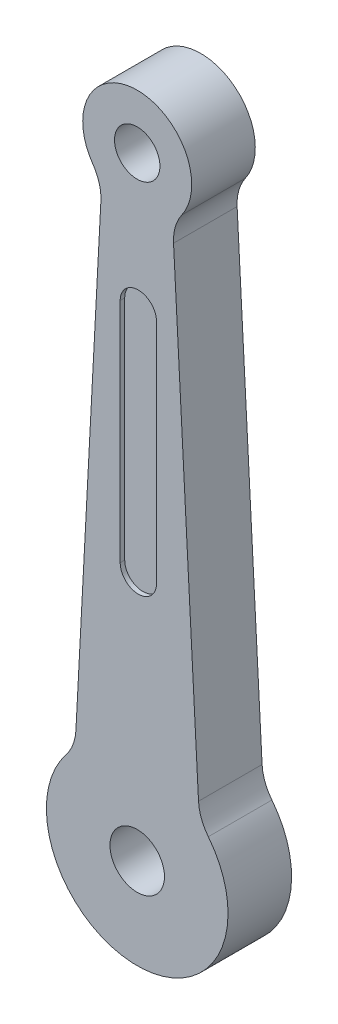
ISO-10303-21;
HEADER;
FILE_DESCRIPTION(('STEP AP214'),'2;1');
FILE_NAME('part.step','',(''),(''),'','','');
FILE_SCHEMA(('AUTOMOTIVE_DESIGN { 1 0 10303 214 1 1 1 1 }'));
ENDSEC;
DATA;
#1=APPLICATION_CONTEXT('core data for automotive mechanical design processes');
#2=APPLICATION_PROTOCOL_DEFINITION('international standard','automotive_design',2000,#1);
#3=PRODUCT_CONTEXT('',#1,'mechanical');
#4=PRODUCT('Part','Part','',(#3));
#5=PRODUCT_RELATED_PRODUCT_CATEGORY('part','',(#4));
#6=PRODUCT_DEFINITION_FORMATION('','',#4);
#7=PRODUCT_DEFINITION_CONTEXT('part definition',#1,'design');
#8=PRODUCT_DEFINITION('design','',#6,#7);
#9=PRODUCT_DEFINITION_SHAPE('','',#8);
#10=(LENGTH_UNIT() NAMED_UNIT(*) SI_UNIT(.MILLI.,.METRE.));
#11=(NAMED_UNIT(*) PLANE_ANGLE_UNIT() SI_UNIT($,.RADIAN.));
#12=(NAMED_UNIT(*) SI_UNIT($,.STERADIAN.) SOLID_ANGLE_UNIT());
#13=UNCERTAINTY_MEASURE_WITH_UNIT(LENGTH_MEASURE(1.E-05),#10,'distance_accuracy_value','');
#14=(GEOMETRIC_REPRESENTATION_CONTEXT(3) GLOBAL_UNCERTAINTY_ASSIGNED_CONTEXT((#13)) GLOBAL_UNIT_ASSIGNED_CONTEXT((#10,
#11,#12)) REPRESENTATION_CONTEXT('',''));
#15=CARTESIAN_POINT('',(0.,0.,0.));
#16=DIRECTION('',(0.,0.,1.));
#17=DIRECTION('',(1.,0.,0.));
#18=AXIS2_PLACEMENT_3D('',#15,#16,#17);
#19=CARTESIAN_POINT('',(-17.9859552555201,122.330926886847,-14.));
#20=DIRECTION('',(0.,0.,1.));
#21=DIRECTION('',(1.,0.,0.));
#22=AXIS2_PLACEMENT_3D('',#19,#20,#21);
#23=CYLINDRICAL_SURFACE('',#22,10.);
#24=CARTESIAN_POINT('',(-17.9859552555201,122.330926886847,0.));
#25=DIRECTION('',(0.,0.,-1.));
#26=DIRECTION('',(1.,0.,0.));
#27=AXIS2_PLACEMENT_3D('',#24,#25,#26);
#28=CIRCLE('',#27,10.);
#29=CARTESIAN_POINT('',(-9.81052104846552,128.089596483735,0.));
#30=VERTEX_POINT('',#29);
#31=CARTESIAN_POINT('',(-8.,121.801117831856,0.));
#32=VERTEX_POINT('',#31);
#33=EDGE_CURVE('E233',#30,#32,#28,.T.);
#34=ORIENTED_EDGE('',*,*,#33,.F.);
#35=DIRECTION('',(0.,0.,1.));
#36=VECTOR('',#35,1.);
#37=CARTESIAN_POINT('',(-9.81052104846552,128.089596483735,-14.));
#38=LINE('',#37,#36);
#39=CARTESIAN_POINT('',(-9.81052104846552,128.089596483735,-14.));
#40=VERTEX_POINT('',#39);
#41=EDGE_CURVE('E11',#40,#30,#38,.T.);
#42=ORIENTED_EDGE('',*,*,#41,.F.);
#43=CARTESIAN_POINT('',(-17.9859552555201,122.330926886847,-14.));
#44=DIRECTION('',(0.,0.,-1.));
#45=DIRECTION('',(1.,0.,0.));
#46=AXIS2_PLACEMENT_3D('',#43,#44,#45);
#47=CIRCLE('',#46,10.);
#48=CARTESIAN_POINT('',(-8.,121.801117831856,-14.));
#49=VERTEX_POINT('',#48);
#50=EDGE_CURVE('E257',#40,#49,#47,.T.);
#51=ORIENTED_EDGE('',*,*,#50,.T.);
#52=DIRECTION('',(0.,0.,1.));
#53=VECTOR('',#52,1.);
#54=CARTESIAN_POINT('',(-8.,121.801117831856,-14.));
#55=LINE('',#54,#53);
#56=EDGE_CURVE('E41',#49,#32,#55,.T.);
#57=ORIENTED_EDGE('',*,*,#56,.T.);
#58=EDGE_LOOP('',(#34,#42,#51,#57));
#59=FACE_BOUND('',#58,.T.);
#60=ADVANCED_FACE('F38',(#59),#23,.F.);
#61=CARTESIAN_POINT('',(0.,135.,-14.));
#62=DIRECTION('',(0.,0.,1.));
#63=DIRECTION('',(1.,0.,0.));
#64=AXIS2_PLACEMENT_3D('',#61,#62,#63);
#65=CYLINDRICAL_SURFACE('',#64,12.);
#66=CARTESIAN_POINT('',(0.,135.,0.));
#67=DIRECTION('',(0.,0.,1.));
#68=DIRECTION('',(1.,0.,0.));
#69=AXIS2_PLACEMENT_3D('',#66,#67,#68);
#70=CIRCLE('',#69,12.);
#71=CARTESIAN_POINT('',(9.81052104846553,128.089596483735,0.));
#72=VERTEX_POINT('',#71);
#73=EDGE_CURVE('E254',#72,#30,#70,.T.);
#74=ORIENTED_EDGE('',*,*,#73,.F.);
#75=DIRECTION('',(0.,0.,1.));
#76=VECTOR('',#75,1.);
#77=CARTESIAN_POINT('',(9.81052104846553,128.089596483735,-14.));
#78=LINE('',#77,#76);
#79=CARTESIAN_POINT('',(9.81052104846553,128.089596483735,-14.));
#80=VERTEX_POINT('',#79);
#81=EDGE_CURVE('E46',#80,#72,#78,.T.);
#82=ORIENTED_EDGE('',*,*,#81,.F.);
#83=CARTESIAN_POINT('',(0.,135.,-14.));
#84=DIRECTION('',(0.,0.,1.));
#85=DIRECTION('',(1.,0.,0.));
#86=AXIS2_PLACEMENT_3D('',#83,#84,#85);
#87=CIRCLE('',#86,12.);
#88=EDGE_CURVE('E278',#80,#40,#87,.T.);
#89=ORIENTED_EDGE('',*,*,#88,.T.);
#90=ORIENTED_EDGE('',*,*,#41,.T.);
#91=EDGE_LOOP('',(#74,#82,#89,#90));
#92=FACE_BOUND('',#91,.T.);
#93=ADVANCED_FACE('F303',(#92),#65,.T.);
#94=CARTESIAN_POINT('',(17.9859552555201,122.330926886847,-14.));
#95=DIRECTION('',(0.,0.,1.));
#96=DIRECTION('',(1.,0.,0.));
#97=AXIS2_PLACEMENT_3D('',#94,#95,#96);
#98=CYLINDRICAL_SURFACE('',#97,10.);
#99=CARTESIAN_POINT('',(17.9859552555201,122.330926886847,0.));
#100=DIRECTION('',(0.,0.,-1.));
#101=DIRECTION('',(-1.,0.,0.));
#102=AXIS2_PLACEMENT_3D('',#99,#100,#101);
#103=CIRCLE('',#102,10.);
#104=CARTESIAN_POINT('',(8.,121.801117831856,0.));
#105=VERTEX_POINT('',#104);
#106=EDGE_CURVE('E251',#105,#72,#103,.T.);
#107=ORIENTED_EDGE('',*,*,#106,.F.);
#108=DIRECTION('',(0.,0.,1.));
#109=VECTOR('',#108,1.);
#110=CARTESIAN_POINT('',(8.,121.801117831856,-14.));
#111=LINE('',#110,#109);
#112=CARTESIAN_POINT('',(8.,121.801117831856,-14.));
#113=VERTEX_POINT('',#112);
#114=EDGE_CURVE('E282',#113,#105,#111,.T.);
#115=ORIENTED_EDGE('',*,*,#114,.F.);
#116=CARTESIAN_POINT('',(17.9859552555201,122.330926886847,-14.));
#117=DIRECTION('',(0.,0.,-1.));
#118=DIRECTION('',(-1.,0.,0.));
#119=AXIS2_PLACEMENT_3D('',#116,#117,#118);
#120=CIRCLE('',#119,10.);
#121=EDGE_CURVE('E275',#113,#80,#120,.T.);
#122=ORIENTED_EDGE('',*,*,#121,.T.);
#123=ORIENTED_EDGE('',*,*,#81,.T.);
#124=EDGE_LOOP('',(#107,#115,#122,#123));
#125=FACE_BOUND('',#124,.T.);
#126=ADVANCED_FACE('F323',(#125),#98,.F.);
#127=CARTESIAN_POINT('',(8.,121.801117831856,-14.));
#128=DIRECTION('',(0.998595525552012,0.0529809054990608,0.));
#129=DIRECTION('',(-0.0529809054990608,0.998595525552012,0.));
#130=AXIS2_PLACEMENT_3D('',#127,#128,#129);
#131=PLANE('',#130);
#132=DIRECTION('',(-0.0529809054990608,0.998595525552012,0.));
#133=VECTOR('',#132,1.);
#134=CARTESIAN_POINT('',(8.,121.801117831856,0.));
#135=LINE('',#134,#133);
#136=CARTESIAN_POINT('',(13.5,18.1359324447652,0.));
#137=VERTEX_POINT('',#136);
#138=EDGE_CURVE('E248',#137,#105,#135,.T.);
#139=ORIENTED_EDGE('',*,*,#138,.F.);
#140=DIRECTION('',(0.,0.,1.));
#141=VECTOR('',#140,1.);
#142=CARTESIAN_POINT('',(13.5,18.1359324447652,-14.));
#143=LINE('',#142,#141);
#144=CARTESIAN_POINT('',(13.5,18.1359324447652,-14.));
#145=VERTEX_POINT('',#144);
#146=EDGE_CURVE('E284',#145,#137,#143,.T.);
#147=ORIENTED_EDGE('',*,*,#146,.F.);
#148=DIRECTION('',(-0.0529809054990608,0.998595525552012,0.));
#149=VECTOR('',#148,1.);
#150=CARTESIAN_POINT('',(8.,121.801117831856,-14.));
#151=LINE('',#150,#149);
#152=EDGE_CURVE('E272',#145,#113,#151,.T.);
#153=ORIENTED_EDGE('',*,*,#152,.T.);
#154=ORIENTED_EDGE('',*,*,#114,.T.);
#155=EDGE_LOOP('',(#139,#147,#153,#154));
#156=FACE_BOUND('',#155,.T.);
#157=ADVANCED_FACE('F321',(#156),#131,.T.);
#158=CARTESIAN_POINT('',(23.4859552555201,18.6657414997558,-14.));
#159=DIRECTION('',(0.,0.,1.));
#160=DIRECTION('',(1.,0.,0.));
#161=AXIS2_PLACEMENT_3D('',#158,#159,#160);
#162=CYLINDRICAL_SURFACE('',#161,10.);
#163=CARTESIAN_POINT('',(23.4859552555201,18.6657414997558,0.));
#164=DIRECTION('',(0.,0.,-1.));
#165=DIRECTION('',(-1.,0.,0.));
#166=AXIS2_PLACEMENT_3D('',#163,#164,#165);
#167=CIRCLE('',#166,10.);
#168=CARTESIAN_POINT('',(15.6573035036801,12.4438276665039,0.));
#169=VERTEX_POINT('',#168);
#170=EDGE_CURVE('E245',#169,#137,#167,.T.);
#171=ORIENTED_EDGE('',*,*,#170,.F.);
#172=DIRECTION('',(0.,0.,1.));
#173=VECTOR('',#172,1.);
#174=CARTESIAN_POINT('',(15.6573035036801,12.4438276665039,-14.));
#175=LINE('',#174,#173);
#176=CARTESIAN_POINT('',(15.6573035036801,12.4438276665039,-14.));
#177=VERTEX_POINT('',#176);
#178=EDGE_CURVE('E286',#177,#169,#175,.T.);
#179=ORIENTED_EDGE('',*,*,#178,.F.);
#180=CARTESIAN_POINT('',(23.4859552555201,18.6657414997558,-14.));
#181=DIRECTION('',(0.,0.,-1.));
#182=DIRECTION('',(-1.,0.,0.));
#183=AXIS2_PLACEMENT_3D('',#180,#181,#182);
#184=CIRCLE('',#183,10.);
#185=EDGE_CURVE('E269',#177,#145,#184,.T.);
#186=ORIENTED_EDGE('',*,*,#185,.T.);
#187=ORIENTED_EDGE('',*,*,#146,.T.);
#188=EDGE_LOOP('',(#171,#179,#186,#187));
#189=FACE_BOUND('',#188,.T.);
#190=ADVANCED_FACE('F317',(#189),#162,.F.);
#191=CARTESIAN_POINT('',(0.,0.,-14.));
#192=DIRECTION('',(0.,0.,1.));
#193=DIRECTION('',(1.,0.,0.));
#194=AXIS2_PLACEMENT_3D('',#191,#192,#193);
#195=CYLINDRICAL_SURFACE('',#194,20.);
#196=CARTESIAN_POINT('',(0.,0.,0.));
#197=DIRECTION('',(0.,0.,1.));
#198=DIRECTION('',(1.,0.,0.));
#199=AXIS2_PLACEMENT_3D('',#196,#197,#198);
#200=CIRCLE('',#199,20.);
#201=CARTESIAN_POINT('',(-15.6573035036801,12.4438276665039,0.));
#202=VERTEX_POINT('',#201);
#203=EDGE_CURVE('E242',#202,#169,#200,.T.);
#204=ORIENTED_EDGE('',*,*,#203,.F.);
#205=DIRECTION('',(0.,0.,1.));
#206=VECTOR('',#205,1.);
#207=CARTESIAN_POINT('',(-15.6573035036801,12.4438276665039,-14.));
#208=LINE('',#207,#206);
#209=CARTESIAN_POINT('',(-15.6573035036801,12.4438276665039,-14.));
#210=VERTEX_POINT('',#209);
#211=EDGE_CURVE('E288',#210,#202,#208,.T.);
#212=ORIENTED_EDGE('',*,*,#211,.F.);
#213=CARTESIAN_POINT('',(0.,0.,-14.));
#214=DIRECTION('',(0.,0.,1.));
#215=DIRECTION('',(1.,0.,0.));
#216=AXIS2_PLACEMENT_3D('',#213,#214,#215);
#217=CIRCLE('',#216,20.);
#218=EDGE_CURVE('E266',#210,#177,#217,.T.);
#219=ORIENTED_EDGE('',*,*,#218,.T.);
#220=ORIENTED_EDGE('',*,*,#178,.T.);
#221=EDGE_LOOP('',(#204,#212,#219,#220));
#222=FACE_BOUND('',#221,.T.);
#223=ADVANCED_FACE('F315',(#222),#195,.T.);
#224=CARTESIAN_POINT('',(-23.4859552555201,18.6657414997558,-14.));
#225=DIRECTION('',(0.,0.,1.));
#226=DIRECTION('',(1.,0.,0.));
#227=AXIS2_PLACEMENT_3D('',#224,#225,#226);
#228=CYLINDRICAL_SURFACE('',#227,10.);
#229=CARTESIAN_POINT('',(-23.4859552555201,18.6657414997558,0.));
#230=DIRECTION('',(0.,0.,-1.));
#231=DIRECTION('',(1.,0.,0.));
#232=AXIS2_PLACEMENT_3D('',#229,#230,#231);
#233=CIRCLE('',#232,10.);
#234=CARTESIAN_POINT('',(-13.5,18.1359324447652,0.));
#235=VERTEX_POINT('',#234);
#236=EDGE_CURVE('E239',#235,#202,#233,.T.);
#237=ORIENTED_EDGE('',*,*,#236,.F.);
#238=DIRECTION('',(0.,0.,1.));
#239=VECTOR('',#238,1.);
#240=CARTESIAN_POINT('',(-13.5,18.1359324447652,-14.));
#241=LINE('',#240,#239);
#242=CARTESIAN_POINT('',(-13.5,18.1359324447652,-14.));
#243=VERTEX_POINT('',#242);
#244=EDGE_CURVE('E289',#243,#235,#241,.T.);
#245=ORIENTED_EDGE('',*,*,#244,.F.);
#246=CARTESIAN_POINT('',(-23.4859552555201,18.6657414997558,-14.));
#247=DIRECTION('',(0.,0.,-1.));
#248=DIRECTION('',(1.,0.,0.));
#249=AXIS2_PLACEMENT_3D('',#246,#247,#248);
#250=CIRCLE('',#249,10.);
#251=EDGE_CURVE('E263',#243,#210,#250,.T.);
#252=ORIENTED_EDGE('',*,*,#251,.T.);
#253=ORIENTED_EDGE('',*,*,#211,.T.);
#254=EDGE_LOOP('',(#237,#245,#252,#253));
#255=FACE_BOUND('',#254,.T.);
#256=ADVANCED_FACE('F311',(#255),#228,.F.);
#257=CARTESIAN_POINT('',(-8.,121.801117831856,-14.));
#258=DIRECTION('',(-0.998595525552012,0.0529809054990608,0.));
#259=DIRECTION('',(-0.0529809054990608,-0.998595525552012,0.));
#260=AXIS2_PLACEMENT_3D('',#257,#258,#259);
#261=PLANE('',#260);
#262=DIRECTION('',(-0.0529809054990608,-0.998595525552012,0.));
#263=VECTOR('',#262,1.);
#264=CARTESIAN_POINT('',(-8.,121.801117831856,0.));
#265=LINE('',#264,#263);
#266=EDGE_CURVE('E236',#32,#235,#265,.T.);
#267=ORIENTED_EDGE('',*,*,#266,.F.);
#268=ORIENTED_EDGE('',*,*,#56,.F.);
#269=DIRECTION('',(-0.0529809054990608,-0.998595525552012,0.));
#270=VECTOR('',#269,1.);
#271=CARTESIAN_POINT('',(-8.,121.801117831856,-14.));
#272=LINE('',#271,#270);
#273=EDGE_CURVE('E260',#49,#243,#272,.T.);
#274=ORIENTED_EDGE('',*,*,#273,.T.);
#275=ORIENTED_EDGE('',*,*,#244,.T.);
#276=EDGE_LOOP('',(#267,#268,#274,#275));
#277=FACE_BOUND('',#276,.T.);
#278=ADVANCED_FACE('F297',(#277),#261,.T.);
#279=CARTESIAN_POINT('',(-17.9859552555201,122.330926886847,-14.));
#280=DIRECTION('',(0.,0.,1.));
#281=DIRECTION('',(1.,0.,0.));
#282=AXIS2_PLACEMENT_3D('',#279,#280,#281);
#283=PLANE('',#282);
#284=DIRECTION('',(0.,-1.,0.));
#285=VECTOR('',#284,1.);
#286=CARTESIAN_POINT('',(4.24807271995307,105.,-14.));
#287=LINE('',#286,#285);
#288=CARTESIAN_POINT('',(4.24807271995307,105.,-14.));
#289=VERTEX_POINT('',#288);
#290=CARTESIAN_POINT('',(4.24807271995308,55.,-14.));
#291=VERTEX_POINT('',#290);
#292=EDGE_CURVE('E166',#289,#291,#287,.T.);
#293=ORIENTED_EDGE('',*,*,#292,.F.);
#294=CARTESIAN_POINT('',(0.248072719953071,105.,-14.));
#295=DIRECTION('',(0.,0.,-1.));
#296=DIRECTION('',(-1.,0.,0.));
#297=AXIS2_PLACEMENT_3D('',#294,#295,#296);
#298=CIRCLE('',#297,4.);
#299=CARTESIAN_POINT('',(-3.75192728004693,105.,-14.));
#300=VERTEX_POINT('',#299);
#301=EDGE_CURVE('E54',#300,#289,#298,.T.);
#302=ORIENTED_EDGE('',*,*,#301,.F.);
#303=DIRECTION('',(0.,1.,0.));
#304=VECTOR('',#303,1.);
#305=CARTESIAN_POINT('',(-3.75192728004692,55.,-14.));
#306=LINE('',#305,#304);
#307=CARTESIAN_POINT('',(-3.75192728004692,55.,-14.));
#308=VERTEX_POINT('',#307);
#309=EDGE_CURVE('E173',#308,#300,#306,.T.);
#310=ORIENTED_EDGE('',*,*,#309,.F.);
#311=CARTESIAN_POINT('',(0.248072719953078,55.,-14.));
#312=DIRECTION('',(0.,0.,-1.));
#313=DIRECTION('',(-1.,0.,0.));
#314=AXIS2_PLACEMENT_3D('',#311,#312,#313);
#315=CIRCLE('',#314,4.);
#316=EDGE_CURVE('E155',#291,#308,#315,.T.);
#317=ORIENTED_EDGE('',*,*,#316,.F.);
#318=EDGE_LOOP('',(#293,#302,#310,#317));
#319=FACE_BOUND('',#318,.T.);
#320=CARTESIAN_POINT('',(0.,135.,-14.));
#321=DIRECTION('',(0.,0.,1.));
#322=DIRECTION('',(1.,0.,0.));
#323=AXIS2_PLACEMENT_3D('',#320,#321,#322);
#324=CIRCLE('',#323,5.00000000000001);
#325=CARTESIAN_POINT('',(5.00000000000001,135.,-14.));
#326=VERTEX_POINT('',#325);
#327=EDGE_CURVE('E224',#326,#326,#324,.T.);
#328=ORIENTED_EDGE('',*,*,#327,.T.);
#329=EDGE_LOOP('',(#328));
#330=FACE_BOUND('',#329,.T.);
#331=CARTESIAN_POINT('',(0.,0.,-14.));
#332=DIRECTION('',(0.,0.,1.));
#333=DIRECTION('',(1.,0.,0.));
#334=AXIS2_PLACEMENT_3D('',#331,#332,#333);
#335=CIRCLE('',#334,6.);
#336=CARTESIAN_POINT('',(6.,0.,-14.));
#337=VERTEX_POINT('',#336);
#338=EDGE_CURVE('E230',#337,#337,#335,.T.);
#339=ORIENTED_EDGE('',*,*,#338,.T.);
#340=EDGE_LOOP('',(#339));
#341=FACE_BOUND('',#340,.T.);
#342=ORIENTED_EDGE('',*,*,#50,.F.);
#343=ORIENTED_EDGE('',*,*,#88,.F.);
#344=ORIENTED_EDGE('',*,*,#121,.F.);
#345=ORIENTED_EDGE('',*,*,#152,.F.);
#346=ORIENTED_EDGE('',*,*,#185,.F.);
#347=ORIENTED_EDGE('',*,*,#218,.F.);
#348=ORIENTED_EDGE('',*,*,#251,.F.);
#349=ORIENTED_EDGE('',*,*,#273,.F.);
#350=EDGE_LOOP('',(#342,#343,#344,#345,#346,#347,#348,#349));
#351=FACE_BOUND('',#350,.T.);
#352=ADVANCED_FACE('F170',(#319,#330,#341,#351),#283,.F.);
#353=CARTESIAN_POINT('',(-17.9859552555201,122.330926886847,0.));
#354=DIRECTION('',(0.,0.,1.));
#355=DIRECTION('',(1.,0.,0.));
#356=AXIS2_PLACEMENT_3D('',#353,#354,#355);
#357=PLANE('',#356);
#358=CARTESIAN_POINT('',(0.248072719953071,105.,0.));
#359=DIRECTION('',(0.,0.,1.));
#360=DIRECTION('',(1.,0.,0.));
#361=AXIS2_PLACEMENT_3D('',#358,#359,#360);
#362=CIRCLE('',#361,4.);
#363=CARTESIAN_POINT('',(4.24807271995307,105.,0.));
#364=VERTEX_POINT('',#363);
#365=CARTESIAN_POINT('',(-3.75192728004693,105.,0.));
#366=VERTEX_POINT('',#365);
#367=EDGE_CURVE('E62',#364,#366,#362,.T.);
#368=ORIENTED_EDGE('',*,*,#367,.F.);
#369=DIRECTION('',(0.,1.,0.));
#370=VECTOR('',#369,1.);
#371=CARTESIAN_POINT('',(4.24807271995307,105.,0.));
#372=LINE('',#371,#370);
#373=CARTESIAN_POINT('',(4.24807271995308,55.,0.));
#374=VERTEX_POINT('',#373);
#375=EDGE_CURVE('E198',#374,#364,#372,.T.);
#376=ORIENTED_EDGE('',*,*,#375,.F.);
#377=CARTESIAN_POINT('',(0.248072719953078,55.,0.));
#378=DIRECTION('',(0.,0.,1.));
#379=DIRECTION('',(1.,0.,0.));
#380=AXIS2_PLACEMENT_3D('',#377,#378,#379);
#381=CIRCLE('',#380,4.);
#382=CARTESIAN_POINT('',(-3.75192728004692,55.,0.));
#383=VERTEX_POINT('',#382);
#384=EDGE_CURVE('E195',#383,#374,#381,.T.);
#385=ORIENTED_EDGE('',*,*,#384,.F.);
#386=DIRECTION('',(0.,-1.,0.));
#387=VECTOR('',#386,1.);
#388=CARTESIAN_POINT('',(-3.75192728004693,105.,0.));
#389=LINE('',#388,#387);
#390=EDGE_CURVE('E192',#366,#383,#389,.T.);
#391=ORIENTED_EDGE('',*,*,#390,.F.);
#392=EDGE_LOOP('',(#368,#376,#385,#391));
#393=FACE_BOUND('',#392,.T.);
#394=CARTESIAN_POINT('',(0.,135.,0.));
#395=DIRECTION('',(0.,0.,1.));
#396=DIRECTION('',(1.,0.,0.));
#397=AXIS2_PLACEMENT_3D('',#394,#395,#396);
#398=CIRCLE('',#397,5.00000000000001);
#399=CARTESIAN_POINT('',(5.00000000000001,135.,0.));
#400=VERTEX_POINT('',#399);
#401=EDGE_CURVE('E216',#400,#400,#398,.T.);
#402=ORIENTED_EDGE('',*,*,#401,.F.);
#403=EDGE_LOOP('',(#402));
#404=FACE_BOUND('',#403,.T.);
#405=CARTESIAN_POINT('',(0.,0.,0.));
#406=DIRECTION('',(0.,0.,1.));
#407=DIRECTION('',(1.,0.,0.));
#408=AXIS2_PLACEMENT_3D('',#405,#406,#407);
#409=CIRCLE('',#408,6.);
#410=CARTESIAN_POINT('',(6.,0.,0.));
#411=VERTEX_POINT('',#410);
#412=EDGE_CURVE('E227',#411,#411,#409,.T.);
#413=ORIENTED_EDGE('',*,*,#412,.F.);
#414=EDGE_LOOP('',(#413));
#415=FACE_BOUND('',#414,.T.);
#416=ORIENTED_EDGE('',*,*,#33,.T.);
#417=ORIENTED_EDGE('',*,*,#266,.T.);
#418=ORIENTED_EDGE('',*,*,#236,.T.);
#419=ORIENTED_EDGE('',*,*,#203,.T.);
#420=ORIENTED_EDGE('',*,*,#170,.T.);
#421=ORIENTED_EDGE('',*,*,#138,.T.);
#422=ORIENTED_EDGE('',*,*,#106,.T.);
#423=ORIENTED_EDGE('',*,*,#73,.T.);
#424=EDGE_LOOP('',(#416,#417,#418,#419,#420,#421,#422,#423));
#425=FACE_BOUND('',#424,.T.);
#426=ADVANCED_FACE('F299',(#393,#404,#415,#425),#357,.T.);
#427=CARTESIAN_POINT('',(0.,0.,-14.));
#428=DIRECTION('',(0.,0.,1.));
#429=DIRECTION('',(1.,0.,0.));
#430=AXIS2_PLACEMENT_3D('',#427,#428,#429);
#431=CYLINDRICAL_SURFACE('',#430,6.);
#432=ORIENTED_EDGE('',*,*,#338,.F.);
#433=EDGE_LOOP('',(#432));
#434=FACE_BOUND('',#433,.T.);
#435=ORIENTED_EDGE('',*,*,#412,.T.);
#436=EDGE_LOOP('',(#435));
#437=FACE_BOUND('',#436,.T.);
#438=ADVANCED_FACE('F387',(#434,#437),#431,.F.);
#439=CARTESIAN_POINT('',(0.,135.,-14.));
#440=DIRECTION('',(0.,0.,1.));
#441=DIRECTION('',(1.,0.,0.));
#442=AXIS2_PLACEMENT_3D('',#439,#440,#441);
#443=CYLINDRICAL_SURFACE('',#442,5.00000000000001);
#444=ORIENTED_EDGE('',*,*,#327,.F.);
#445=EDGE_LOOP('',(#444));
#446=FACE_BOUND('',#445,.T.);
#447=ORIENTED_EDGE('',*,*,#401,.T.);
#448=EDGE_LOOP('',(#447));
#449=FACE_BOUND('',#448,.T.);
#450=ADVANCED_FACE('F392',(#446,#449),#443,.F.);
#451=CARTESIAN_POINT('',(0.248072719953071,105.,-1.));
#452=DIRECTION('',(0.,0.,1.));
#453=DIRECTION('',(1.,0.,0.));
#454=AXIS2_PLACEMENT_3D('',#451,#452,#453);
#455=CYLINDRICAL_SURFACE('',#454,4.);
#456=ORIENTED_EDGE('',*,*,#367,.T.);
#457=DIRECTION('',(0.,0.,1.));
#458=VECTOR('',#457,1.);
#459=CARTESIAN_POINT('',(-3.75192728004693,105.,-1.));
#460=LINE('',#459,#458);
#461=CARTESIAN_POINT('',(-3.75192728004693,105.,-1.));
#462=VERTEX_POINT('',#461);
#463=EDGE_CURVE('E213',#462,#366,#460,.T.);
#464=ORIENTED_EDGE('',*,*,#463,.F.);
#465=CARTESIAN_POINT('',(0.248072719953071,105.,-1.));
#466=DIRECTION('',(0.,0.,1.));
#467=DIRECTION('',(1.,0.,0.));
#468=AXIS2_PLACEMENT_3D('',#465,#466,#467);
#469=CIRCLE('',#468,4.);
#470=CARTESIAN_POINT('',(4.24807271995307,105.,-1.));
#471=VERTEX_POINT('',#470);
#472=EDGE_CURVE('E201',#471,#462,#469,.T.);
#473=ORIENTED_EDGE('',*,*,#472,.F.);
#474=DIRECTION('',(0.,0.,1.));
#475=VECTOR('',#474,1.);
#476=CARTESIAN_POINT('',(4.24807271995307,105.,-1.));
#477=LINE('',#476,#475);
#478=EDGE_CURVE('E214',#471,#364,#477,.T.);
#479=ORIENTED_EDGE('',*,*,#478,.T.);
#480=EDGE_LOOP('',(#456,#464,#473,#479));
#481=FACE_BOUND('',#480,.T.);
#482=ADVANCED_FACE('F404',(#481),#455,.F.);
#483=CARTESIAN_POINT('',(4.24807271995307,105.,-1.));
#484=DIRECTION('',(1.,0.,0.));
#485=DIRECTION('',(0.,1.,0.));
#486=AXIS2_PLACEMENT_3D('',#483,#484,#485);
#487=PLANE('',#486);
#488=ORIENTED_EDGE('',*,*,#375,.T.);
#489=ORIENTED_EDGE('',*,*,#478,.F.);
#490=DIRECTION('',(0.,1.,0.));
#491=VECTOR('',#490,1.);
#492=CARTESIAN_POINT('',(4.24807271995307,105.,-1.));
#493=LINE('',#492,#491);
#494=CARTESIAN_POINT('',(4.24807271995308,55.,-1.));
#495=VERTEX_POINT('',#494);
#496=EDGE_CURVE('E210',#495,#471,#493,.T.);
#497=ORIENTED_EDGE('',*,*,#496,.F.);
#498=DIRECTION('',(0.,0.,1.));
#499=VECTOR('',#498,1.);
#500=CARTESIAN_POINT('',(4.24807271995308,55.,-1.));
#501=LINE('',#500,#499);
#502=EDGE_CURVE('E217',#495,#374,#501,.T.);
#503=ORIENTED_EDGE('',*,*,#502,.T.);
#504=EDGE_LOOP('',(#488,#489,#497,#503));
#505=FACE_BOUND('',#504,.T.);
#506=ADVANCED_FACE('F421',(#505),#487,.F.);
#507=CARTESIAN_POINT('',(0.248072719953078,55.,-1.));
#508=DIRECTION('',(0.,0.,1.));
#509=DIRECTION('',(1.,0.,0.));
#510=AXIS2_PLACEMENT_3D('',#507,#508,#509);
#511=CYLINDRICAL_SURFACE('',#510,4.);
#512=ORIENTED_EDGE('',*,*,#384,.T.);
#513=ORIENTED_EDGE('',*,*,#502,.F.);
#514=CARTESIAN_POINT('',(0.248072719953078,55.,-1.));
#515=DIRECTION('',(0.,0.,1.));
#516=DIRECTION('',(1.,0.,0.));
#517=AXIS2_PLACEMENT_3D('',#514,#515,#516);
#518=CIRCLE('',#517,4.);
#519=CARTESIAN_POINT('',(-3.75192728004692,55.,-1.));
#520=VERTEX_POINT('',#519);
#521=EDGE_CURVE('E207',#520,#495,#518,.T.);
#522=ORIENTED_EDGE('',*,*,#521,.F.);
#523=DIRECTION('',(0.,0.,1.));
#524=VECTOR('',#523,1.);
#525=CARTESIAN_POINT('',(-3.75192728004692,55.,-1.));
#526=LINE('',#525,#524);
#527=EDGE_CURVE('E219',#520,#383,#526,.T.);
#528=ORIENTED_EDGE('',*,*,#527,.T.);
#529=EDGE_LOOP('',(#512,#513,#522,#528));
#530=FACE_BOUND('',#529,.T.);
#531=ADVANCED_FACE('F430',(#530),#511,.F.);
#532=CARTESIAN_POINT('',(-3.75192728004693,105.,-1.));
#533=DIRECTION('',(-1.,0.,0.));
#534=DIRECTION('',(0.,-1.,0.));
#535=AXIS2_PLACEMENT_3D('',#532,#533,#534);
#536=PLANE('',#535);
#537=ORIENTED_EDGE('',*,*,#390,.T.);
#538=ORIENTED_EDGE('',*,*,#527,.F.);
#539=DIRECTION('',(0.,-1.,0.));
#540=VECTOR('',#539,1.);
#541=CARTESIAN_POINT('',(-3.75192728004693,105.,-1.));
#542=LINE('',#541,#540);
#543=EDGE_CURVE('E204',#462,#520,#542,.T.);
#544=ORIENTED_EDGE('',*,*,#543,.F.);
#545=ORIENTED_EDGE('',*,*,#463,.T.);
#546=EDGE_LOOP('',(#537,#538,#544,#545));
#547=FACE_BOUND('',#546,.T.);
#548=ADVANCED_FACE('F440',(#547),#536,.F.);
#549=CARTESIAN_POINT('',(0.248072719953071,105.,-1.));
#550=DIRECTION('',(0.,0.,1.));
#551=DIRECTION('',(1.,0.,0.));
#552=AXIS2_PLACEMENT_3D('',#549,#550,#551);
#553=PLANE('',#552);
#554=ORIENTED_EDGE('',*,*,#472,.T.);
#555=ORIENTED_EDGE('',*,*,#543,.T.);
#556=ORIENTED_EDGE('',*,*,#521,.T.);
#557=ORIENTED_EDGE('',*,*,#496,.T.);
#558=EDGE_LOOP('',(#554,#555,#556,#557));
#559=FACE_BOUND('',#558,.T.);
#560=ADVANCED_FACE('F450',(#559),#553,.T.);
#561=CARTESIAN_POINT('',(0.248072719953071,105.,-13.));
#562=DIRECTION('',(0.,0.,-1.));
#563=DIRECTION('',(-1.,0.,0.));
#564=AXIS2_PLACEMENT_3D('',#561,#562,#563);
#565=CYLINDRICAL_SURFACE('',#564,4.);
#566=ORIENTED_EDGE('',*,*,#301,.T.);
#567=DIRECTION('',(0.,0.,-1.));
#568=VECTOR('',#567,1.);
#569=CARTESIAN_POINT('',(4.24807271995307,105.,-13.));
#570=LINE('',#569,#568);
#571=CARTESIAN_POINT('',(4.24807271995307,105.,-13.));
#572=VERTEX_POINT('',#571);
#573=EDGE_CURVE('E163',#572,#289,#570,.T.);
#574=ORIENTED_EDGE('',*,*,#573,.F.);
#575=CARTESIAN_POINT('',(0.248072719953071,105.,-13.));
#576=DIRECTION('',(0.,0.,-1.));
#577=DIRECTION('',(-1.,0.,0.));
#578=AXIS2_PLACEMENT_3D('',#575,#576,#577);
#579=CIRCLE('',#578,4.);
#580=CARTESIAN_POINT('',(-3.75192728004693,105.,-13.));
#581=VERTEX_POINT('',#580);
#582=EDGE_CURVE('E175',#581,#572,#579,.T.);
#583=ORIENTED_EDGE('',*,*,#582,.F.);
#584=DIRECTION('',(0.,0.,-1.));
#585=VECTOR('',#584,1.);
#586=CARTESIAN_POINT('',(-3.75192728004693,105.,-13.));
#587=LINE('',#586,#585);
#588=EDGE_CURVE('E187',#581,#300,#587,.T.);
#589=ORIENTED_EDGE('',*,*,#588,.T.);
#590=EDGE_LOOP('',(#566,#574,#583,#589));
#591=FACE_BOUND('',#590,.T.);
#592=ADVANCED_FACE('F460',(#591),#565,.F.);
#593=CARTESIAN_POINT('',(-3.75192728004692,55.,-13.));
#594=DIRECTION('',(-1.,0.,0.));
#595=DIRECTION('',(0.,-1.,0.));
#596=AXIS2_PLACEMENT_3D('',#593,#594,#595);
#597=PLANE('',#596);
#598=ORIENTED_EDGE('',*,*,#309,.T.);
#599=ORIENTED_EDGE('',*,*,#588,.F.);
#600=DIRECTION('',(0.,1.,0.));
#601=VECTOR('',#600,1.);
#602=CARTESIAN_POINT('',(-3.75192728004692,55.,-13.));
#603=LINE('',#602,#601);
#604=CARTESIAN_POINT('',(-3.75192728004692,55.,-13.));
#605=VERTEX_POINT('',#604);
#606=EDGE_CURVE('E184',#605,#581,#603,.T.);
#607=ORIENTED_EDGE('',*,*,#606,.F.);
#608=DIRECTION('',(0.,0.,-1.));
#609=VECTOR('',#608,1.);
#610=CARTESIAN_POINT('',(-3.75192728004692,55.,-13.));
#611=LINE('',#610,#609);
#612=EDGE_CURVE('E162',#605,#308,#611,.T.);
#613=ORIENTED_EDGE('',*,*,#612,.T.);
#614=EDGE_LOOP('',(#598,#599,#607,#613));
#615=FACE_BOUND('',#614,.T.);
#616=ADVANCED_FACE('F476',(#615),#597,.F.);
#617=CARTESIAN_POINT('',(0.248072719953078,55.,-13.));
#618=DIRECTION('',(0.,0.,-1.));
#619=DIRECTION('',(-1.,0.,0.));
#620=AXIS2_PLACEMENT_3D('',#617,#618,#619);
#621=CYLINDRICAL_SURFACE('',#620,4.);
#622=ORIENTED_EDGE('',*,*,#316,.T.);
#623=ORIENTED_EDGE('',*,*,#612,.F.);
#624=CARTESIAN_POINT('',(0.248072719953078,55.,-13.));
#625=DIRECTION('',(0.,0.,-1.));
#626=DIRECTION('',(-1.,0.,0.));
#627=AXIS2_PLACEMENT_3D('',#624,#625,#626);
#628=CIRCLE('',#627,4.);
#629=CARTESIAN_POINT('',(4.24807271995308,55.,-13.));
#630=VERTEX_POINT('',#629);
#631=EDGE_CURVE('E158',#630,#605,#628,.T.);
#632=ORIENTED_EDGE('',*,*,#631,.F.);
#633=DIRECTION('',(0.,0.,-1.));
#634=VECTOR('',#633,1.);
#635=CARTESIAN_POINT('',(4.24807271995308,55.,-13.));
#636=LINE('',#635,#634);
#637=EDGE_CURVE('E151',#630,#291,#636,.T.);
#638=ORIENTED_EDGE('',*,*,#637,.T.);
#639=EDGE_LOOP('',(#622,#623,#632,#638));
#640=FACE_BOUND('',#639,.T.);
#641=ADVANCED_FACE('F153',(#640),#621,.F.);
#642=CARTESIAN_POINT('',(4.24807271995307,105.,-13.));
#643=DIRECTION('',(1.,0.,0.));
#644=DIRECTION('',(0.,1.,0.));
#645=AXIS2_PLACEMENT_3D('',#642,#643,#644);
#646=PLANE('',#645);
#647=ORIENTED_EDGE('',*,*,#292,.T.);
#648=ORIENTED_EDGE('',*,*,#637,.F.);
#649=DIRECTION('',(0.,-1.,0.));
#650=VECTOR('',#649,1.);
#651=CARTESIAN_POINT('',(4.24807271995307,105.,-13.));
#652=LINE('',#651,#650);
#653=EDGE_CURVE('E181',#572,#630,#652,.T.);
#654=ORIENTED_EDGE('',*,*,#653,.F.);
#655=ORIENTED_EDGE('',*,*,#573,.T.);
#656=EDGE_LOOP('',(#647,#648,#654,#655));
#657=FACE_BOUND('',#656,.T.);
#658=ADVANCED_FACE('F167',(#657),#646,.F.);
#659=CARTESIAN_POINT('',(0.248072719953071,105.,-13.));
#660=DIRECTION('',(0.,0.,-1.));
#661=DIRECTION('',(-1.,0.,0.));
#662=AXIS2_PLACEMENT_3D('',#659,#660,#661);
#663=PLANE('',#662);
#664=ORIENTED_EDGE('',*,*,#582,.T.);
#665=ORIENTED_EDGE('',*,*,#653,.T.);
#666=ORIENTED_EDGE('',*,*,#631,.T.);
#667=ORIENTED_EDGE('',*,*,#606,.T.);
#668=EDGE_LOOP('',(#664,#665,#666,#667));
#669=FACE_BOUND('',#668,.T.);
#670=ADVANCED_FACE('F502',(#669),#663,.T.);
#671=CLOSED_SHELL('',(#60,#93,#126,#157,#190,#223,#256,#278,#352,#426,#438,#450,#482,#506,#531,
#548,#560,#592,#616,#641,#658,#670));
#672=MANIFOLD_SOLID_BREP('B2',#671);
#673=ADVANCED_BREP_SHAPE_REPRESENTATION('',(#18,#672),#14);
#674=SHAPE_DEFINITION_REPRESENTATION(#9,#673);
ENDSEC;
END-ISO-10303-21;
